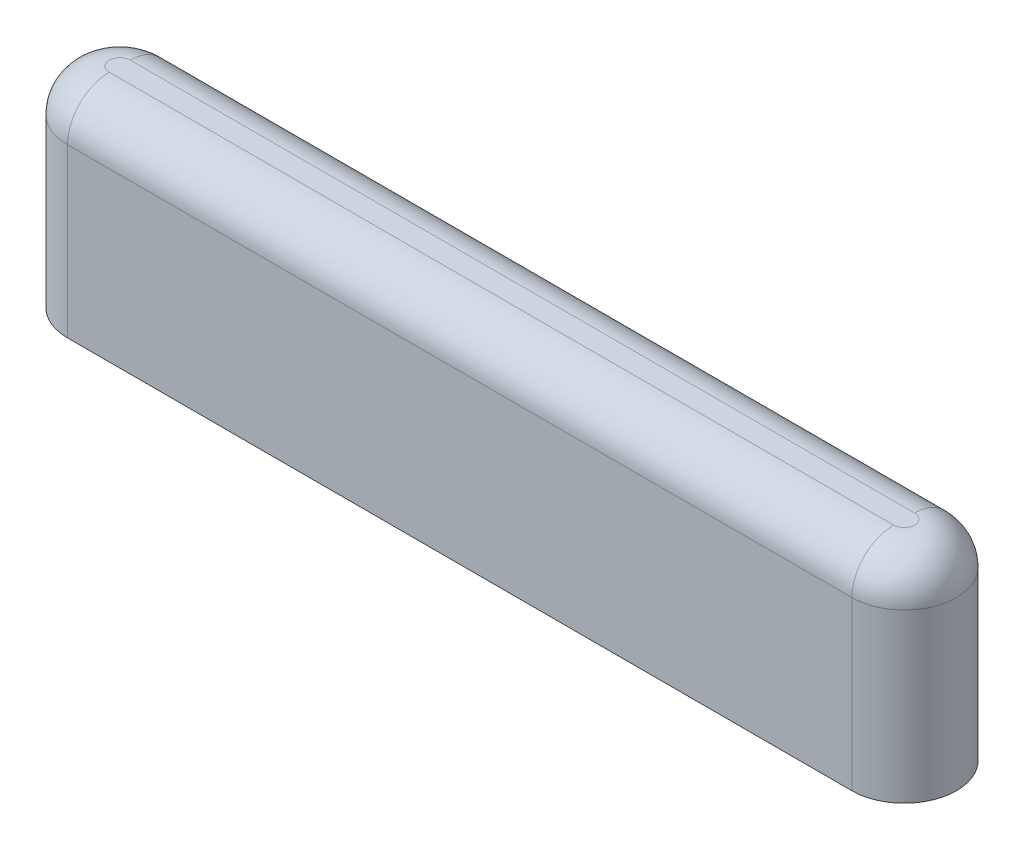
ISO-10303-21;
HEADER;
FILE_DESCRIPTION(('STEP AP214'),'2;1');
FILE_NAME('part.step','',(''),(''),'','','');
FILE_SCHEMA(('AUTOMOTIVE_DESIGN { 1 0 10303 214 1 1 1 1 }'));
ENDSEC;
DATA;
#1=APPLICATION_CONTEXT('core data for automotive mechanical design processes');
#2=APPLICATION_PROTOCOL_DEFINITION('international standard','automotive_design',2000,#1);
#3=PRODUCT_CONTEXT('',#1,'mechanical');
#4=PRODUCT('Part','Part','',(#3));
#5=PRODUCT_RELATED_PRODUCT_CATEGORY('part','',(#4));
#6=PRODUCT_DEFINITION_FORMATION('','',#4);
#7=PRODUCT_DEFINITION_CONTEXT('part definition',#1,'design');
#8=PRODUCT_DEFINITION('design','',#6,#7);
#9=PRODUCT_DEFINITION_SHAPE('','',#8);
#10=(LENGTH_UNIT() NAMED_UNIT(*) SI_UNIT(.MILLI.,.METRE.));
#11=(NAMED_UNIT(*) PLANE_ANGLE_UNIT() SI_UNIT($,.RADIAN.));
#12=(NAMED_UNIT(*) SI_UNIT($,.STERADIAN.) SOLID_ANGLE_UNIT());
#13=UNCERTAINTY_MEASURE_WITH_UNIT(LENGTH_MEASURE(1.E-05),#10,'distance_accuracy_value','');
#14=(GEOMETRIC_REPRESENTATION_CONTEXT(3) GLOBAL_UNCERTAINTY_ASSIGNED_CONTEXT((#13)) GLOBAL_UNIT_ASSIGNED_CONTEXT((#10,
#11,#12)) REPRESENTATION_CONTEXT('',''));
#15=CARTESIAN_POINT('',(0.,0.,0.));
#16=DIRECTION('',(0.,0.,1.));
#17=DIRECTION('',(1.,0.,0.));
#18=AXIS2_PLACEMENT_3D('',#15,#16,#17);
#19=CARTESIAN_POINT('',(22.5,1.5,0.));
#20=DIRECTION('',(0.,-1.,0.));
#21=DIRECTION('',(0.,0.,-1.));
#22=AXIS2_PLACEMENT_3D('',#19,#20,#21);
#23=PLANE('',#22);
#24=CARTESIAN_POINT('',(22.5,1.5,0.));
#25=DIRECTION('',(0.,-1.,0.));
#26=DIRECTION('',(0.,0.,-1.));
#27=AXIS2_PLACEMENT_3D('',#24,#25,#26);
#28=CIRCLE('',#27,2.74999999999999);
#29=CARTESIAN_POINT('',(22.5,1.5,-2.75));
#30=VERTEX_POINT('',#29);
#31=EDGE_CURVE('E11',#30,#30,#28,.T.);
#32=ORIENTED_EDGE('',*,*,#31,.T.);
#33=EDGE_LOOP('',(#32));
#34=FACE_BOUND('',#33,.T.);
#35=ADVANCED_FACE('F33',(#34),#23,.T.);
#36=CARTESIAN_POINT('',(22.5,1.5,0.));
#37=DIRECTION('',(0.,-1.,0.));
#38=DIRECTION('',(0.,0.,-1.));
#39=AXIS2_PLACEMENT_3D('',#36,#37,#38);
#40=CYLINDRICAL_SURFACE('',#39,2.74999999999999);
#41=ORIENTED_EDGE('',*,*,#31,.F.);
#42=EDGE_LOOP('',(#41));
#43=FACE_BOUND('',#42,.T.);
#44=CARTESIAN_POINT('',(22.5,0.,0.));
#45=DIRECTION('',(0.,-1.,0.));
#46=DIRECTION('',(0.,0.,-1.));
#47=AXIS2_PLACEMENT_3D('',#44,#45,#46);
#48=CIRCLE('',#47,2.74999999999999);
#49=CARTESIAN_POINT('',(22.5,0.,-2.75));
#50=VERTEX_POINT('',#49);
#51=EDGE_CURVE('E40',#50,#50,#48,.T.);
#52=ORIENTED_EDGE('',*,*,#51,.T.);
#53=EDGE_LOOP('',(#52));
#54=FACE_BOUND('',#53,.T.);
#55=ADVANCED_FACE('F150',(#43,#54),#40,.F.);
#56=CARTESIAN_POINT('',(37.5,20.,0.));
#57=DIRECTION('',(0.,-1.,0.));
#58=DIRECTION('',(0.,0.,-1.));
#59=AXIS2_PLACEMENT_3D('',#56,#57,#58);
#60=CYLINDRICAL_SURFACE('',#59,5.);
#61=DIRECTION('',(0.,-1.,0.));
#62=VECTOR('',#61,1.);
#63=CARTESIAN_POINT('',(37.5,20.,-5.));
#64=LINE('',#63,#62);
#65=CARTESIAN_POINT('',(37.5,16.,-5.));
#66=VERTEX_POINT('',#65);
#67=CARTESIAN_POINT('',(37.5,0.,-5.));
#68=VERTEX_POINT('',#67);
#69=EDGE_CURVE('E86',#66,#68,#64,.T.);
#70=ORIENTED_EDGE('',*,*,#69,.F.);
#71=CARTESIAN_POINT('',(37.5,16.,0.));
#72=DIRECTION('',(0.,1.,0.));
#73=DIRECTION('',(0.,0.,1.));
#74=AXIS2_PLACEMENT_3D('',#71,#72,#73);
#75=CIRCLE('',#74,5.);
#76=CARTESIAN_POINT('',(37.5,16.,5.));
#77=VERTEX_POINT('',#76);
#78=EDGE_CURVE('E136',#66,#77,#75,.F.);
#79=ORIENTED_EDGE('',*,*,#78,.T.);
#80=DIRECTION('',(0.,-1.,0.));
#81=VECTOR('',#80,1.);
#82=CARTESIAN_POINT('',(37.5,20.,5.));
#83=LINE('',#82,#81);
#84=CARTESIAN_POINT('',(37.5,0.,5.));
#85=VERTEX_POINT('',#84);
#86=EDGE_CURVE('E111',#77,#85,#83,.T.);
#87=ORIENTED_EDGE('',*,*,#86,.T.);
#88=CARTESIAN_POINT('',(37.5,0.,0.));
#89=DIRECTION('',(0.,1.,0.));
#90=DIRECTION('',(0.,0.,1.));
#91=AXIS2_PLACEMENT_3D('',#88,#89,#90);
#92=CIRCLE('',#91,5.);
#93=EDGE_CURVE('E105',#85,#68,#92,.T.);
#94=ORIENTED_EDGE('',*,*,#93,.T.);
#95=EDGE_LOOP('',(#70,#79,#87,#94));
#96=FACE_BOUND('',#95,.T.);
#97=ADVANCED_FACE('F110',(#96),#60,.T.);
#98=CARTESIAN_POINT('',(37.5,20.,-5.));
#99=DIRECTION('',(0.,0.,1.));
#100=DIRECTION('',(1.,0.,0.));
#101=AXIS2_PLACEMENT_3D('',#98,#99,#100);
#102=PLANE('',#101);
#103=DIRECTION('',(0.,-1.,0.));
#104=VECTOR('',#103,1.);
#105=CARTESIAN_POINT('',(-37.5,20.,-5.));
#106=LINE('',#105,#104);
#107=CARTESIAN_POINT('',(-37.5,16.,-5.));
#108=VERTEX_POINT('',#107);
#109=CARTESIAN_POINT('',(-37.5,0.,-5.));
#110=VERTEX_POINT('',#109);
#111=EDGE_CURVE('E98',#108,#110,#106,.T.);
#112=ORIENTED_EDGE('',*,*,#111,.F.);
#113=DIRECTION('',(-1.,0.,0.));
#114=VECTOR('',#113,1.);
#115=CARTESIAN_POINT('',(37.5,16.,-5.));
#116=LINE('',#115,#114);
#117=EDGE_CURVE('E92',#108,#66,#116,.F.);
#118=ORIENTED_EDGE('',*,*,#117,.T.);
#119=ORIENTED_EDGE('',*,*,#69,.T.);
#120=DIRECTION('',(-1.,0.,0.));
#121=VECTOR('',#120,1.);
#122=CARTESIAN_POINT('',(37.5,0.,-5.));
#123=LINE('',#122,#121);
#124=EDGE_CURVE('E89',#68,#110,#123,.T.);
#125=ORIENTED_EDGE('',*,*,#124,.T.);
#126=EDGE_LOOP('',(#112,#118,#119,#125));
#127=FACE_BOUND('',#126,.T.);
#128=ADVANCED_FACE('F88',(#127),#102,.F.);
#129=CARTESIAN_POINT('',(-37.5,20.,0.));
#130=DIRECTION('',(0.,-1.,0.));
#131=DIRECTION('',(0.,0.,-1.));
#132=AXIS2_PLACEMENT_3D('',#129,#130,#131);
#133=CYLINDRICAL_SURFACE('',#132,5.00000000000001);
#134=DIRECTION('',(0.,-1.,0.));
#135=VECTOR('',#134,1.);
#136=CARTESIAN_POINT('',(-37.5,20.,5.00000000000001));
#137=LINE('',#136,#135);
#138=CARTESIAN_POINT('',(-37.5,16.,5.00000000000001));
#139=VERTEX_POINT('',#138);
#140=CARTESIAN_POINT('',(-37.5,0.,5.00000000000001));
#141=VERTEX_POINT('',#140);
#142=EDGE_CURVE('E125',#139,#141,#137,.T.);
#143=ORIENTED_EDGE('',*,*,#142,.F.);
#144=CARTESIAN_POINT('',(-37.5,16.,0.));
#145=DIRECTION('',(0.,1.,0.));
#146=DIRECTION('',(0.,0.,1.));
#147=AXIS2_PLACEMENT_3D('',#144,#145,#146);
#148=CIRCLE('',#147,5.00000000000001);
#149=EDGE_CURVE('E54',#139,#108,#148,.F.);
#150=ORIENTED_EDGE('',*,*,#149,.T.);
#151=ORIENTED_EDGE('',*,*,#111,.T.);
#152=CARTESIAN_POINT('',(-37.5,0.,0.));
#153=DIRECTION('',(0.,-1.,0.));
#154=DIRECTION('',(0.,0.,-1.));
#155=AXIS2_PLACEMENT_3D('',#152,#153,#154);
#156=CIRCLE('',#155,5.00000000000001);
#157=EDGE_CURVE('E108',#141,#110,#156,.T.);
#158=ORIENTED_EDGE('',*,*,#157,.F.);
#159=EDGE_LOOP('',(#143,#150,#151,#158));
#160=FACE_BOUND('',#159,.T.);
#161=ADVANCED_FACE('F195',(#160),#133,.T.);
#162=CARTESIAN_POINT('',(37.5,20.,5.));
#163=DIRECTION('',(0.,0.,1.));
#164=DIRECTION('',(1.,0.,0.));
#165=AXIS2_PLACEMENT_3D('',#162,#163,#164);
#166=PLANE('',#165);
#167=ORIENTED_EDGE('',*,*,#86,.F.);
#168=DIRECTION('',(-1.,0.,0.));
#169=VECTOR('',#168,1.);
#170=CARTESIAN_POINT('',(37.5,16.,5.));
#171=LINE('',#170,#169);
#172=EDGE_CURVE('E47',#77,#139,#171,.T.);
#173=ORIENTED_EDGE('',*,*,#172,.T.);
#174=ORIENTED_EDGE('',*,*,#142,.T.);
#175=DIRECTION('',(-1.,0.,0.));
#176=VECTOR('',#175,1.);
#177=CARTESIAN_POINT('',(37.5,0.,5.));
#178=LINE('',#177,#176);
#179=EDGE_CURVE('E122',#85,#141,#178,.T.);
#180=ORIENTED_EDGE('',*,*,#179,.F.);
#181=EDGE_LOOP('',(#167,#173,#174,#180));
#182=FACE_BOUND('',#181,.T.);
#183=ADVANCED_FACE('F163',(#182),#166,.T.);
#184=CARTESIAN_POINT('',(37.5,20.,0.));
#185=DIRECTION('',(0.,1.,0.));
#186=DIRECTION('',(0.,0.,1.));
#187=AXIS2_PLACEMENT_3D('',#184,#185,#186);
#188=PLANE('',#187);
#189=DIRECTION('',(-1.,0.,0.));
#190=VECTOR('',#189,1.);
#191=CARTESIAN_POINT('',(37.5,20.,0.999999999999997));
#192=LINE('',#191,#190);
#193=CARTESIAN_POINT('',(-37.5,20.,1.00000000000001));
#194=VERTEX_POINT('',#193);
#195=CARTESIAN_POINT('',(37.5,20.,0.999999999999997));
#196=VERTEX_POINT('',#195);
#197=EDGE_CURVE('E97',#194,#196,#192,.F.);
#198=ORIENTED_EDGE('',*,*,#197,.T.);
#199=CARTESIAN_POINT('',(37.5,20.,0.));
#200=DIRECTION('',(0.,1.,0.));
#201=DIRECTION('',(0.,0.,1.));
#202=AXIS2_PLACEMENT_3D('',#199,#200,#201);
#203=CIRCLE('',#202,1.);
#204=CARTESIAN_POINT('',(37.5,20.,-1.));
#205=VERTEX_POINT('',#204);
#206=EDGE_CURVE('E133',#196,#205,#203,.T.);
#207=ORIENTED_EDGE('',*,*,#206,.T.);
#208=DIRECTION('',(-1.,0.,0.));
#209=VECTOR('',#208,1.);
#210=CARTESIAN_POINT('',(-37.5,20.,-1.));
#211=LINE('',#210,#209);
#212=CARTESIAN_POINT('',(-37.5,20.,-1.));
#213=VERTEX_POINT('',#212);
#214=EDGE_CURVE('E131',#205,#213,#211,.T.);
#215=ORIENTED_EDGE('',*,*,#214,.T.);
#216=CARTESIAN_POINT('',(-37.5,20.,0.));
#217=DIRECTION('',(0.,1.,0.));
#218=DIRECTION('',(0.,0.,1.));
#219=AXIS2_PLACEMENT_3D('',#216,#217,#218);
#220=CIRCLE('',#219,1.00000000000001);
#221=EDGE_CURVE('E129',#213,#194,#220,.T.);
#222=ORIENTED_EDGE('',*,*,#221,.T.);
#223=EDGE_LOOP('',(#198,#207,#215,#222));
#224=FACE_BOUND('',#223,.T.);
#225=ADVANCED_FACE('F153',(#224),#188,.T.);
#226=CARTESIAN_POINT('',(37.5,0.,0.));
#227=DIRECTION('',(0.,1.,0.));
#228=DIRECTION('',(0.,0.,1.));
#229=AXIS2_PLACEMENT_3D('',#226,#227,#228);
#230=PLANE('',#229);
#231=CARTESIAN_POINT('',(-7.49999999999998,0.,0.));
#232=DIRECTION('',(0.,-1.,0.));
#233=DIRECTION('',(0.,0.,-1.));
#234=AXIS2_PLACEMENT_3D('',#231,#232,#233);
#235=CIRCLE('',#234,2.74999999999999);
#236=CARTESIAN_POINT('',(-7.49999999999998,0.,-2.75));
#237=VERTEX_POINT('',#236);
#238=EDGE_CURVE('E296',#237,#237,#235,.T.);
#239=ORIENTED_EDGE('',*,*,#238,.F.);
#240=EDGE_LOOP('',(#239));
#241=FACE_BOUND('',#240,.T.);
#242=CARTESIAN_POINT('',(-37.5,0.,0.));
#243=DIRECTION('',(0.,-1.,0.));
#244=DIRECTION('',(0.,0.,-1.));
#245=AXIS2_PLACEMENT_3D('',#242,#243,#244);
#246=CIRCLE('',#245,2.74999999999999);
#247=CARTESIAN_POINT('',(-37.5,0.,-2.74999999999999));
#248=VERTEX_POINT('',#247);
#249=EDGE_CURVE('E118',#248,#248,#246,.T.);
#250=ORIENTED_EDGE('',*,*,#249,.F.);
#251=EDGE_LOOP('',(#250));
#252=FACE_BOUND('',#251,.T.);
#253=ORIENTED_EDGE('',*,*,#93,.F.);
#254=ORIENTED_EDGE('',*,*,#179,.T.);
#255=ORIENTED_EDGE('',*,*,#157,.T.);
#256=ORIENTED_EDGE('',*,*,#124,.F.);
#257=EDGE_LOOP('',(#253,#254,#255,#256));
#258=FACE_BOUND('',#257,.T.);
#259=ORIENTED_EDGE('',*,*,#51,.F.);
#260=EDGE_LOOP('',(#259));
#261=FACE_BOUND('',#260,.T.);
#262=ADVANCED_FACE('F102',(#241,#252,#258,#261),#230,.F.);
#263=CARTESIAN_POINT('',(-37.5,16.,0.));
#264=DIRECTION('',(0.,1.,0.));
#265=DIRECTION('',(0.,0.,1.));
#266=AXIS2_PLACEMENT_3D('',#263,#264,#265);
#267=DEGENERATE_TOROIDAL_SURFACE('',#266,1.00000000000001,4.,.T.);
#268=CARTESIAN_POINT('',(-37.5,16.,-1.));
#269=DIRECTION('',(1.,0.,0.));
#270=DIRECTION('',(0.,0.,-1.));
#271=AXIS2_PLACEMENT_3D('',#268,#269,#270);
#272=CIRCLE('',#271,4.);
#273=EDGE_CURVE('E115',#108,#213,#272,.T.);
#274=ORIENTED_EDGE('',*,*,#273,.F.);
#275=ORIENTED_EDGE('',*,*,#149,.F.);
#276=CARTESIAN_POINT('',(-37.5,16.,1.00000000000001));
#277=DIRECTION('',(1.,0.,0.));
#278=DIRECTION('',(0.,0.,-1.));
#279=AXIS2_PLACEMENT_3D('',#276,#277,#278);
#280=CIRCLE('',#279,4.);
#281=EDGE_CURVE('E112',#194,#139,#280,.T.);
#282=ORIENTED_EDGE('',*,*,#281,.F.);
#283=ORIENTED_EDGE('',*,*,#221,.F.);
#284=EDGE_LOOP('',(#274,#275,#282,#283));
#285=FACE_BOUND('',#284,.T.);
#286=ADVANCED_FACE('F152',(#285),#267,.T.);
#287=CARTESIAN_POINT('',(37.5,16.,0.999999999999997));
#288=DIRECTION('',(-1.,0.,0.));
#289=DIRECTION('',(0.,0.,1.));
#290=AXIS2_PLACEMENT_3D('',#287,#288,#289);
#291=CYLINDRICAL_SURFACE('',#290,4.);
#292=ORIENTED_EDGE('',*,*,#281,.T.);
#293=ORIENTED_EDGE('',*,*,#172,.F.);
#294=CARTESIAN_POINT('',(37.5,16.,0.999999999999997));
#295=DIRECTION('',(1.,0.,0.));
#296=DIRECTION('',(0.,0.,-1.));
#297=AXIS2_PLACEMENT_3D('',#294,#295,#296);
#298=CIRCLE('',#297,4.);
#299=EDGE_CURVE('E143',#196,#77,#298,.T.);
#300=ORIENTED_EDGE('',*,*,#299,.F.);
#301=ORIENTED_EDGE('',*,*,#197,.F.);
#302=EDGE_LOOP('',(#292,#293,#300,#301));
#303=FACE_BOUND('',#302,.T.);
#304=ADVANCED_FACE('F160',(#303),#291,.T.);
#305=CARTESIAN_POINT('',(37.5,16.,-1.));
#306=DIRECTION('',(1.,0.,0.));
#307=DIRECTION('',(0.,0.,-1.));
#308=AXIS2_PLACEMENT_3D('',#305,#306,#307);
#309=CYLINDRICAL_SURFACE('',#308,4.);
#310=ORIENTED_EDGE('',*,*,#273,.T.);
#311=ORIENTED_EDGE('',*,*,#214,.F.);
#312=CARTESIAN_POINT('',(37.5,16.,-1.));
#313=DIRECTION('',(1.,0.,0.));
#314=DIRECTION('',(0.,0.,-1.));
#315=AXIS2_PLACEMENT_3D('',#312,#313,#314);
#316=CIRCLE('',#315,4.);
#317=EDGE_CURVE('E141',#66,#205,#316,.T.);
#318=ORIENTED_EDGE('',*,*,#317,.F.);
#319=ORIENTED_EDGE('',*,*,#117,.F.);
#320=EDGE_LOOP('',(#310,#311,#318,#319));
#321=FACE_BOUND('',#320,.T.);
#322=ADVANCED_FACE('F183',(#321),#309,.T.);
#323=CARTESIAN_POINT('',(37.5,16.,0.));
#324=DIRECTION('',(0.,1.,0.));
#325=DIRECTION('',(0.,0.,1.));
#326=AXIS2_PLACEMENT_3D('',#323,#324,#325);
#327=DEGENERATE_TOROIDAL_SURFACE('',#326,1.,4.,.T.);
#328=ORIENTED_EDGE('',*,*,#299,.T.);
#329=ORIENTED_EDGE('',*,*,#78,.F.);
#330=ORIENTED_EDGE('',*,*,#317,.T.);
#331=ORIENTED_EDGE('',*,*,#206,.F.);
#332=EDGE_LOOP('',(#328,#329,#330,#331));
#333=FACE_BOUND('',#332,.T.);
#334=ADVANCED_FACE('F187',(#333),#327,.T.);
#335=CARTESIAN_POINT('',(-37.5,1.5,0.));
#336=DIRECTION('',(0.,-1.,0.));
#337=DIRECTION('',(0.,0.,-1.));
#338=AXIS2_PLACEMENT_3D('',#335,#336,#337);
#339=CYLINDRICAL_SURFACE('',#338,2.74999999999999);
#340=CARTESIAN_POINT('',(-37.5,1.5,0.));
#341=DIRECTION('',(0.,-1.,0.));
#342=DIRECTION('',(0.,0.,-1.));
#343=AXIS2_PLACEMENT_3D('',#340,#341,#342);
#344=CIRCLE('',#343,2.74999999999999);
#345=CARTESIAN_POINT('',(-37.5,1.5,-2.74999999999999));
#346=VERTEX_POINT('',#345);
#347=EDGE_CURVE('E144',#346,#346,#344,.T.);
#348=ORIENTED_EDGE('',*,*,#347,.F.);
#349=EDGE_LOOP('',(#348));
#350=FACE_BOUND('',#349,.T.);
#351=ORIENTED_EDGE('',*,*,#249,.T.);
#352=EDGE_LOOP('',(#351));
#353=FACE_BOUND('',#352,.T.);
#354=ADVANCED_FACE('F190',(#350,#353),#339,.F.);
#355=CARTESIAN_POINT('',(-37.5,1.5,0.));
#356=DIRECTION('',(0.,-1.,0.));
#357=DIRECTION('',(0.,0.,-1.));
#358=AXIS2_PLACEMENT_3D('',#355,#356,#357);
#359=PLANE('',#358);
#360=ORIENTED_EDGE('',*,*,#347,.T.);
#361=EDGE_LOOP('',(#360));
#362=FACE_BOUND('',#361,.T.);
#363=ADVANCED_FACE('F248',(#362),#359,.T.);
#364=CARTESIAN_POINT('',(-7.49999999999998,1.5,0.));
#365=DIRECTION('',(0.,-1.,0.));
#366=DIRECTION('',(0.,0.,-1.));
#367=AXIS2_PLACEMENT_3D('',#364,#365,#366);
#368=CYLINDRICAL_SURFACE('',#367,2.74999999999999);
#369=CARTESIAN_POINT('',(-7.49999999999998,1.5,0.));
#370=DIRECTION('',(0.,-1.,0.));
#371=DIRECTION('',(0.,0.,-1.));
#372=AXIS2_PLACEMENT_3D('',#369,#370,#371);
#373=CIRCLE('',#372,2.74999999999999);
#374=CARTESIAN_POINT('',(-7.49999999999998,1.5,-2.75));
#375=VERTEX_POINT('',#374);
#376=EDGE_CURVE('E295',#375,#375,#373,.T.);
#377=ORIENTED_EDGE('',*,*,#376,.F.);
#378=EDGE_LOOP('',(#377));
#379=FACE_BOUND('',#378,.T.);
#380=ORIENTED_EDGE('',*,*,#238,.T.);
#381=EDGE_LOOP('',(#380));
#382=FACE_BOUND('',#381,.T.);
#383=ADVANCED_FACE('F257',(#379,#382),#368,.F.);
#384=CARTESIAN_POINT('',(-7.49999999999998,1.5,0.));
#385=DIRECTION('',(0.,-1.,0.));
#386=DIRECTION('',(0.,0.,-1.));
#387=AXIS2_PLACEMENT_3D('',#384,#385,#386);
#388=PLANE('',#387);
#389=ORIENTED_EDGE('',*,*,#376,.T.);
#390=EDGE_LOOP('',(#389));
#391=FACE_BOUND('',#390,.T.);
#392=ADVANCED_FACE('F279',(#391),#388,.T.);
#393=CLOSED_SHELL('',(#35,#55,#97,#128,#161,#183,#225,#262,#286,#304,#322,#334,#354,#363,#383,#392));
#394=MANIFOLD_SOLID_BREP('B2',#393);
#395=ADVANCED_BREP_SHAPE_REPRESENTATION('',(#18,#394),#14);
#396=SHAPE_DEFINITION_REPRESENTATION(#9,#395);
ENDSEC;
END-ISO-10303-21;
